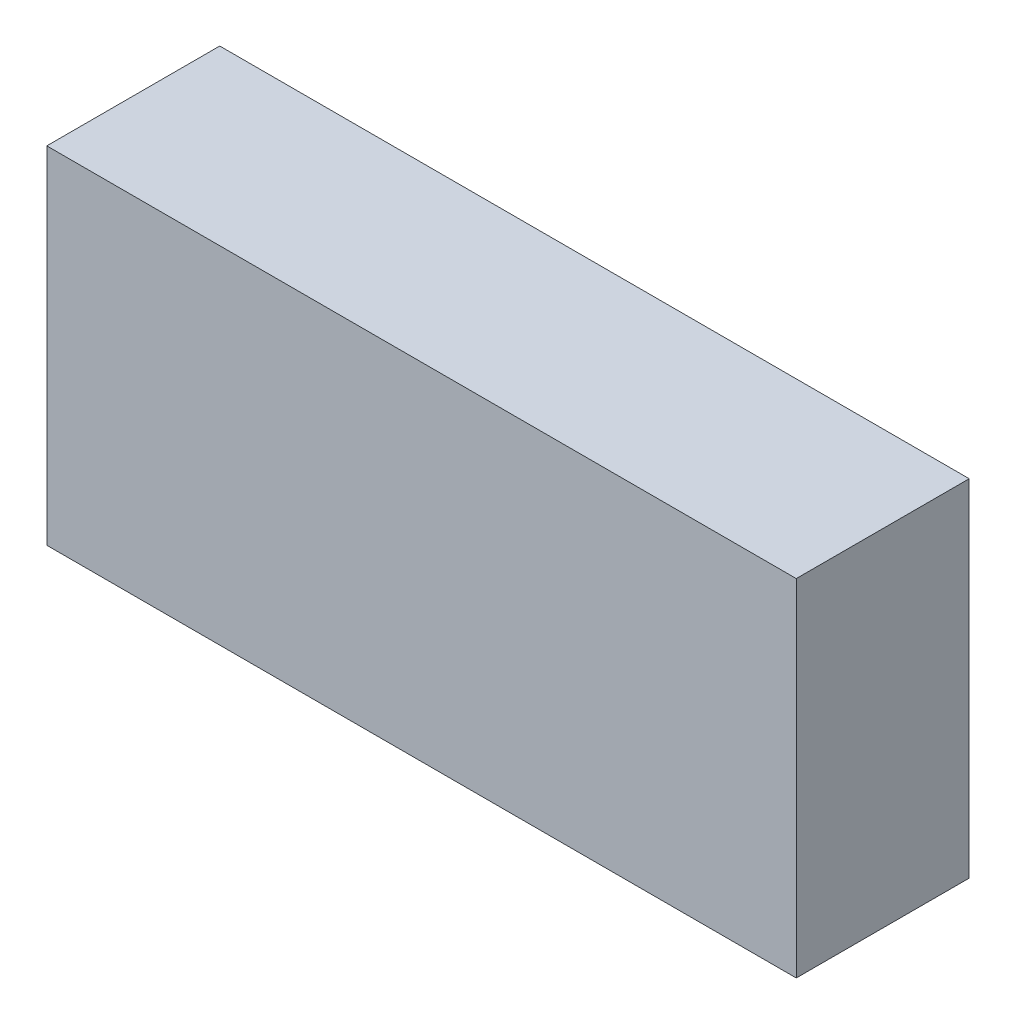
ISO-10303-21;
HEADER;
FILE_DESCRIPTION(('STEP AP214'),'2;1');
FILE_NAME('part.step','',(''),(''),'','','');
FILE_SCHEMA(('AUTOMOTIVE_DESIGN { 1 0 10303 214 1 1 1 1 }'));
ENDSEC;
DATA;
#1=APPLICATION_CONTEXT('core data for automotive mechanical design processes');
#2=APPLICATION_PROTOCOL_DEFINITION('international standard','automotive_design',2000,#1);
#3=PRODUCT_CONTEXT('',#1,'mechanical');
#4=PRODUCT('Part','Part','',(#3));
#5=PRODUCT_RELATED_PRODUCT_CATEGORY('part','',(#4));
#6=PRODUCT_DEFINITION_FORMATION('','',#4);
#7=PRODUCT_DEFINITION_CONTEXT('part definition',#1,'design');
#8=PRODUCT_DEFINITION('design','',#6,#7);
#9=PRODUCT_DEFINITION_SHAPE('','',#8);
#10=(LENGTH_UNIT() NAMED_UNIT(*) SI_UNIT(.MILLI.,.METRE.));
#11=(NAMED_UNIT(*) PLANE_ANGLE_UNIT() SI_UNIT($,.RADIAN.));
#12=(NAMED_UNIT(*) SI_UNIT($,.STERADIAN.) SOLID_ANGLE_UNIT());
#13=UNCERTAINTY_MEASURE_WITH_UNIT(LENGTH_MEASURE(1.E-05),#10,'distance_accuracy_value','');
#14=(GEOMETRIC_REPRESENTATION_CONTEXT(3) GLOBAL_UNCERTAINTY_ASSIGNED_CONTEXT((#13)) GLOBAL_UNIT_ASSIGNED_CONTEXT((#10,
#11,#12)) REPRESENTATION_CONTEXT('',''));
#15=CARTESIAN_POINT('',(0.,0.,0.));
#16=DIRECTION('',(0.,0.,1.));
#17=DIRECTION('',(1.,0.,0.));
#18=AXIS2_PLACEMENT_3D('',#15,#16,#17);
#19=CARTESIAN_POINT('',(41.275,38.1,9.525));
#20=DIRECTION('',(-1.,0.,0.));
#21=DIRECTION('',(0.,0.,1.));
#22=AXIS2_PLACEMENT_3D('',#19,#20,#21);
#23=PLANE('',#22);
#24=DIRECTION('',(0.,0.,-1.));
#25=VECTOR('',#24,1.);
#26=CARTESIAN_POINT('',(41.275,0.,9.525));
#27=LINE('',#26,#25);
#28=CARTESIAN_POINT('',(41.275,0.,9.525));
#29=VERTEX_POINT('',#28);
#30=CARTESIAN_POINT('',(41.275,0.,-9.525));
#31=VERTEX_POINT('',#30);
#32=EDGE_CURVE('E96',#29,#31,#27,.T.);
#33=ORIENTED_EDGE('',*,*,#32,.T.);
#34=DIRECTION('',(0.,-1.,0.));
#35=VECTOR('',#34,1.);
#36=CARTESIAN_POINT('',(41.275,38.1,-9.525));
#37=LINE('',#36,#35);
#38=CARTESIAN_POINT('',(41.275,38.1,-9.525));
#39=VERTEX_POINT('',#38);
#40=EDGE_CURVE('E11',#39,#31,#37,.T.);
#41=ORIENTED_EDGE('',*,*,#40,.F.);
#42=DIRECTION('',(0.,0.,-1.));
#43=VECTOR('',#42,1.);
#44=CARTESIAN_POINT('',(41.275,38.1,9.525));
#45=LINE('',#44,#43);
#46=CARTESIAN_POINT('',(41.275,38.1,9.525));
#47=VERTEX_POINT('',#46);
#48=EDGE_CURVE('E84',#47,#39,#45,.T.);
#49=ORIENTED_EDGE('',*,*,#48,.F.);
#50=DIRECTION('',(0.,-1.,0.));
#51=VECTOR('',#50,1.);
#52=CARTESIAN_POINT('',(41.275,38.1,9.525));
#53=LINE('',#52,#51);
#54=EDGE_CURVE('E92',#47,#29,#53,.T.);
#55=ORIENTED_EDGE('',*,*,#54,.T.);
#56=EDGE_LOOP('',(#33,#41,#49,#55));
#57=FACE_BOUND('',#56,.T.);
#58=ADVANCED_FACE('F33',(#57),#23,.F.);
#59=CARTESIAN_POINT('',(-41.275,38.1,-9.525));
#60=DIRECTION('',(0.,0.,1.));
#61=DIRECTION('',(1.,0.,0.));
#62=AXIS2_PLACEMENT_3D('',#59,#60,#61);
#63=PLANE('',#62);
#64=DIRECTION('',(-1.,0.,0.));
#65=VECTOR('',#64,1.);
#66=CARTESIAN_POINT('',(-41.275,0.,-9.525));
#67=LINE('',#66,#65);
#68=CARTESIAN_POINT('',(-41.275,0.,-9.525));
#69=VERTEX_POINT('',#68);
#70=EDGE_CURVE('E88',#31,#69,#67,.T.);
#71=ORIENTED_EDGE('',*,*,#70,.T.);
#72=DIRECTION('',(0.,-1.,0.));
#73=VECTOR('',#72,1.);
#74=CARTESIAN_POINT('',(-41.275,38.1,-9.525));
#75=LINE('',#74,#73);
#76=CARTESIAN_POINT('',(-41.275,38.1,-9.525));
#77=VERTEX_POINT('',#76);
#78=EDGE_CURVE('E41',#77,#69,#75,.T.);
#79=ORIENTED_EDGE('',*,*,#78,.F.);
#80=DIRECTION('',(-1.,0.,0.));
#81=VECTOR('',#80,1.);
#82=CARTESIAN_POINT('',(-41.275,38.1,-9.525));
#83=LINE('',#82,#81);
#84=EDGE_CURVE('E79',#39,#77,#83,.T.);
#85=ORIENTED_EDGE('',*,*,#84,.F.);
#86=ORIENTED_EDGE('',*,*,#40,.T.);
#87=EDGE_LOOP('',(#71,#79,#85,#86));
#88=FACE_BOUND('',#87,.T.);
#89=ADVANCED_FACE('F87',(#88),#63,.F.);
#90=CARTESIAN_POINT('',(-41.275,38.1,9.525));
#91=DIRECTION('',(1.,0.,0.));
#92=DIRECTION('',(0.,0.,-1.));
#93=AXIS2_PLACEMENT_3D('',#90,#91,#92);
#94=PLANE('',#93);
#95=DIRECTION('',(0.,0.,1.));
#96=VECTOR('',#95,1.);
#97=CARTESIAN_POINT('',(-41.275,0.,9.525));
#98=LINE('',#97,#96);
#99=CARTESIAN_POINT('',(-41.275,0.,9.525));
#100=VERTEX_POINT('',#99);
#101=EDGE_CURVE('E66',#69,#100,#98,.T.);
#102=ORIENTED_EDGE('',*,*,#101,.T.);
#103=DIRECTION('',(0.,-1.,0.));
#104=VECTOR('',#103,1.);
#105=CARTESIAN_POINT('',(-41.275,38.1,9.525));
#106=LINE('',#105,#104);
#107=CARTESIAN_POINT('',(-41.275,38.1,9.525));
#108=VERTEX_POINT('',#107);
#109=EDGE_CURVE('E89',#108,#100,#106,.T.);
#110=ORIENTED_EDGE('',*,*,#109,.F.);
#111=DIRECTION('',(0.,0.,1.));
#112=VECTOR('',#111,1.);
#113=CARTESIAN_POINT('',(-41.275,38.1,9.525));
#114=LINE('',#113,#112);
#115=EDGE_CURVE('E82',#77,#108,#114,.T.);
#116=ORIENTED_EDGE('',*,*,#115,.F.);
#117=ORIENTED_EDGE('',*,*,#78,.T.);
#118=EDGE_LOOP('',(#102,#110,#116,#117));
#119=FACE_BOUND('',#118,.T.);
#120=ADVANCED_FACE('F90',(#119),#94,.F.);
#121=CARTESIAN_POINT('',(-41.275,38.1,9.525));
#122=DIRECTION('',(0.,0.,-1.));
#123=DIRECTION('',(-1.,0.,0.));
#124=AXIS2_PLACEMENT_3D('',#121,#122,#123);
#125=PLANE('',#124);
#126=DIRECTION('',(1.,0.,0.));
#127=VECTOR('',#126,1.);
#128=CARTESIAN_POINT('',(-41.275,0.,9.525));
#129=LINE('',#128,#127);
#130=EDGE_CURVE('E72',#100,#29,#129,.T.);
#131=ORIENTED_EDGE('',*,*,#130,.T.);
#132=ORIENTED_EDGE('',*,*,#54,.F.);
#133=DIRECTION('',(1.,0.,0.));
#134=VECTOR('',#133,1.);
#135=CARTESIAN_POINT('',(-41.275,38.1,9.525));
#136=LINE('',#135,#134);
#137=EDGE_CURVE('E49',#108,#47,#136,.T.);
#138=ORIENTED_EDGE('',*,*,#137,.F.);
#139=ORIENTED_EDGE('',*,*,#109,.T.);
#140=EDGE_LOOP('',(#131,#132,#138,#139));
#141=FACE_BOUND('',#140,.T.);
#142=ADVANCED_FACE('F103',(#141),#125,.F.);
#143=CARTESIAN_POINT('',(0.,38.1,0.));
#144=DIRECTION('',(0.,-1.,0.));
#145=DIRECTION('',(0.,0.,-1.));
#146=AXIS2_PLACEMENT_3D('',#143,#144,#145);
#147=PLANE('',#146);
#148=ORIENTED_EDGE('',*,*,#48,.T.);
#149=ORIENTED_EDGE('',*,*,#84,.T.);
#150=ORIENTED_EDGE('',*,*,#115,.T.);
#151=ORIENTED_EDGE('',*,*,#137,.T.);
#152=EDGE_LOOP('',(#148,#149,#150,#151));
#153=FACE_BOUND('',#152,.T.);
#154=ADVANCED_FACE('F80',(#153),#147,.F.);
#155=CARTESIAN_POINT('',(0.,0.,0.));
#156=DIRECTION('',(0.,-1.,0.));
#157=DIRECTION('',(0.,0.,-1.));
#158=AXIS2_PLACEMENT_3D('',#155,#156,#157);
#159=PLANE('',#158);
#160=ORIENTED_EDGE('',*,*,#32,.F.);
#161=ORIENTED_EDGE('',*,*,#130,.F.);
#162=ORIENTED_EDGE('',*,*,#101,.F.);
#163=ORIENTED_EDGE('',*,*,#70,.F.);
#164=EDGE_LOOP('',(#160,#161,#162,#163));
#165=FACE_BOUND('',#164,.T.);
#166=ADVANCED_FACE('F106',(#165),#159,.T.);
#167=CLOSED_SHELL('',(#58,#89,#120,#142,#154,#166));
#168=MANIFOLD_SOLID_BREP('B2',#167);
#169=ADVANCED_BREP_SHAPE_REPRESENTATION('',(#18,#168),#14);
#170=SHAPE_DEFINITION_REPRESENTATION(#9,#169);
ENDSEC;
END-ISO-10303-21;
